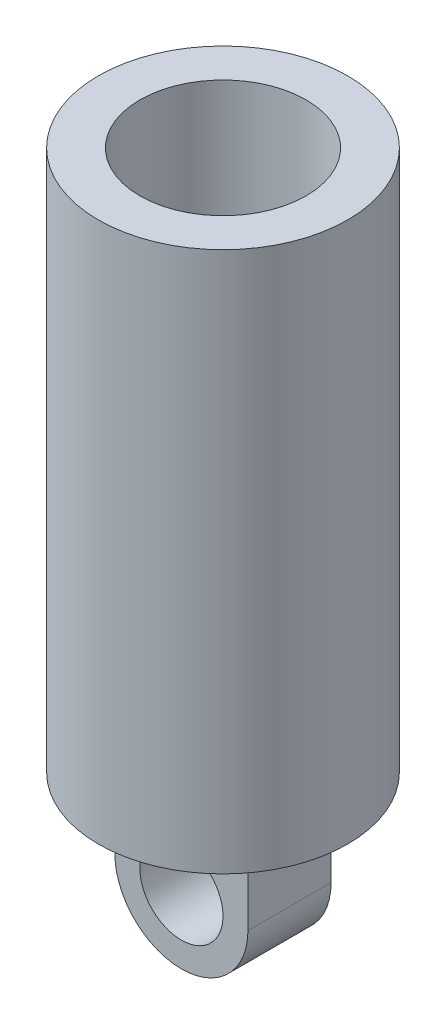
ISO-10303-21;
HEADER;
FILE_DESCRIPTION(('STEP AP214'),'2;1');
FILE_NAME('part.step','',(''),(''),'','','');
FILE_SCHEMA(('AUTOMOTIVE_DESIGN { 1 0 10303 214 1 1 1 1 }'));
ENDSEC;
DATA;
#1=APPLICATION_CONTEXT('core data for automotive mechanical design processes');
#2=APPLICATION_PROTOCOL_DEFINITION('international standard','automotive_design',2000,#1);
#3=PRODUCT_CONTEXT('',#1,'mechanical');
#4=PRODUCT('Part','Part','',(#3));
#5=PRODUCT_RELATED_PRODUCT_CATEGORY('part','',(#4));
#6=PRODUCT_DEFINITION_FORMATION('','',#4);
#7=PRODUCT_DEFINITION_CONTEXT('part definition',#1,'design');
#8=PRODUCT_DEFINITION('design','',#6,#7);
#9=PRODUCT_DEFINITION_SHAPE('','',#8);
#10=(LENGTH_UNIT() NAMED_UNIT(*) SI_UNIT(.MILLI.,.METRE.));
#11=(NAMED_UNIT(*) PLANE_ANGLE_UNIT() SI_UNIT($,.RADIAN.));
#12=(NAMED_UNIT(*) SI_UNIT($,.STERADIAN.) SOLID_ANGLE_UNIT());
#13=UNCERTAINTY_MEASURE_WITH_UNIT(LENGTH_MEASURE(1.E-05),#10,'distance_accuracy_value','');
#14=(GEOMETRIC_REPRESENTATION_CONTEXT(3) GLOBAL_UNCERTAINTY_ASSIGNED_CONTEXT((#13)) GLOBAL_UNIT_ASSIGNED_CONTEXT((#10,
#11,#12)) REPRESENTATION_CONTEXT('',''));
#15=CARTESIAN_POINT('',(0.,0.,0.));
#16=DIRECTION('',(0.,0.,1.));
#17=DIRECTION('',(1.,0.,0.));
#18=AXIS2_PLACEMENT_3D('',#15,#16,#17);
#19=CARTESIAN_POINT('',(-4.,0.,-2.5));
#20=DIRECTION('',(-1.,0.,0.));
#21=DIRECTION('',(0.,0.,-1.));
#22=AXIS2_PLACEMENT_3D('',#19,#20,#21);
#23=PLANE('',#22);
#24=DIRECTION('',(0.,1.,0.));
#25=VECTOR('',#24,1.);
#26=CARTESIAN_POINT('',(-4.,0.,2.5));
#27=LINE('',#26,#25);
#28=CARTESIAN_POINT('',(-4.,0.,2.5));
#29=VERTEX_POINT('',#28);
#30=CARTESIAN_POINT('',(-4.,5.,2.5));
#31=VERTEX_POINT('',#30);
#32=EDGE_CURVE('E104',#29,#31,#27,.T.);
#33=ORIENTED_EDGE('',*,*,#32,.T.);
#34=DIRECTION('',(0.,0.,1.));
#35=VECTOR('',#34,1.);
#36=CARTESIAN_POINT('',(-4.,5.,-2.5));
#37=LINE('',#36,#35);
#38=CARTESIAN_POINT('',(-4.,5.,-2.5));
#39=VERTEX_POINT('',#38);
#40=EDGE_CURVE('E92',#39,#31,#37,.T.);
#41=ORIENTED_EDGE('',*,*,#40,.F.);
#42=DIRECTION('',(0.,1.,0.));
#43=VECTOR('',#42,1.);
#44=CARTESIAN_POINT('',(-4.,0.,-2.5));
#45=LINE('',#44,#43);
#46=CARTESIAN_POINT('',(-4.,0.,-2.5));
#47=VERTEX_POINT('',#46);
#48=EDGE_CURVE('E112',#47,#39,#45,.T.);
#49=ORIENTED_EDGE('',*,*,#48,.F.);
#50=DIRECTION('',(0.,0.,1.));
#51=VECTOR('',#50,1.);
#52=CARTESIAN_POINT('',(-4.,0.,-2.5));
#53=LINE('',#52,#51);
#54=EDGE_CURVE('E48',#47,#29,#53,.T.);
#55=ORIENTED_EDGE('',*,*,#54,.T.);
#56=EDGE_LOOP('',(#33,#41,#49,#55));
#57=FACE_BOUND('',#56,.T.);
#58=ADVANCED_FACE('F39',(#57),#23,.T.);
#59=CARTESIAN_POINT('',(0.,0.,-2.5));
#60=DIRECTION('',(0.,0.,1.));
#61=DIRECTION('',(-1.,0.,0.));
#62=AXIS2_PLACEMENT_3D('',#59,#60,#61);
#63=CYLINDRICAL_SURFACE('',#62,4.);
#64=CARTESIAN_POINT('',(0.,0.,2.5));
#65=DIRECTION('',(0.,0.,1.));
#66=DIRECTION('',(1.,0.,0.));
#67=AXIS2_PLACEMENT_3D('',#64,#65,#66);
#68=CIRCLE('',#67,4.);
#69=CARTESIAN_POINT('',(4.,0.,2.5));
#70=VERTEX_POINT('',#69);
#71=EDGE_CURVE('E102',#29,#70,#68,.T.);
#72=ORIENTED_EDGE('',*,*,#71,.F.);
#73=ORIENTED_EDGE('',*,*,#54,.F.);
#74=CARTESIAN_POINT('',(0.,0.,-2.5));
#75=DIRECTION('',(0.,0.,1.));
#76=DIRECTION('',(1.,0.,0.));
#77=AXIS2_PLACEMENT_3D('',#74,#75,#76);
#78=CIRCLE('',#77,4.);
#79=CARTESIAN_POINT('',(4.,0.,-2.5));
#80=VERTEX_POINT('',#79);
#81=EDGE_CURVE('E84',#47,#80,#78,.T.);
#82=ORIENTED_EDGE('',*,*,#81,.T.);
#83=DIRECTION('',(0.,0.,1.));
#84=VECTOR('',#83,1.);
#85=CARTESIAN_POINT('',(4.,0.,-2.5));
#86=LINE('',#85,#84);
#87=EDGE_CURVE('E98',#80,#70,#86,.T.);
#88=ORIENTED_EDGE('',*,*,#87,.T.);
#89=EDGE_LOOP('',(#72,#73,#82,#88));
#90=FACE_BOUND('',#89,.T.);
#91=ADVANCED_FACE('F150',(#90),#63,.T.);
#92=CARTESIAN_POINT('',(4.,0.,-2.5));
#93=DIRECTION('',(-1.,0.,0.));
#94=DIRECTION('',(0.,0.,-1.));
#95=AXIS2_PLACEMENT_3D('',#92,#93,#94);
#96=PLANE('',#95);
#97=DIRECTION('',(0.,1.,0.));
#98=VECTOR('',#97,1.);
#99=CARTESIAN_POINT('',(4.,0.,2.5));
#100=LINE('',#99,#98);
#101=CARTESIAN_POINT('',(4.,5.,2.5));
#102=VERTEX_POINT('',#101);
#103=EDGE_CURVE('E71',#70,#102,#100,.T.);
#104=ORIENTED_EDGE('',*,*,#103,.F.);
#105=ORIENTED_EDGE('',*,*,#87,.F.);
#106=DIRECTION('',(0.,1.,0.));
#107=VECTOR('',#106,1.);
#108=CARTESIAN_POINT('',(4.,0.,-2.5));
#109=LINE('',#108,#107);
#110=CARTESIAN_POINT('',(4.,5.,-2.5));
#111=VERTEX_POINT('',#110);
#112=EDGE_CURVE('E97',#80,#111,#109,.T.);
#113=ORIENTED_EDGE('',*,*,#112,.T.);
#114=DIRECTION('',(0.,0.,1.));
#115=VECTOR('',#114,1.);
#116=CARTESIAN_POINT('',(4.,5.,-2.5));
#117=LINE('',#116,#115);
#118=EDGE_CURVE('E89',#111,#102,#117,.T.);
#119=ORIENTED_EDGE('',*,*,#118,.T.);
#120=EDGE_LOOP('',(#104,#105,#113,#119));
#121=FACE_BOUND('',#120,.T.);
#122=ADVANCED_FACE('F96',(#121),#96,.F.);
#123=CARTESIAN_POINT('',(0.,0.,-2.5));
#124=DIRECTION('',(0.,0.,1.));
#125=DIRECTION('',(-1.,0.,0.));
#126=AXIS2_PLACEMENT_3D('',#123,#124,#125);
#127=CYLINDRICAL_SURFACE('',#126,2.5);
#128=CARTESIAN_POINT('',(0.,0.,-2.5));
#129=DIRECTION('',(0.,0.,1.));
#130=DIRECTION('',(1.,0.,0.));
#131=AXIS2_PLACEMENT_3D('',#128,#129,#130);
#132=CIRCLE('',#131,2.5);
#133=CARTESIAN_POINT('',(2.5,0.,-2.5));
#134=VERTEX_POINT('',#133);
#135=EDGE_CURVE('E94',#134,#134,#132,.T.);
#136=ORIENTED_EDGE('',*,*,#135,.F.);
#137=EDGE_LOOP('',(#136));
#138=FACE_BOUND('',#137,.T.);
#139=CARTESIAN_POINT('',(0.,0.,2.5));
#140=DIRECTION('',(0.,0.,1.));
#141=DIRECTION('',(1.,0.,0.));
#142=AXIS2_PLACEMENT_3D('',#139,#140,#141);
#143=CIRCLE('',#142,2.5);
#144=CARTESIAN_POINT('',(2.5,0.,2.5));
#145=VERTEX_POINT('',#144);
#146=EDGE_CURVE('E114',#145,#145,#143,.T.);
#147=ORIENTED_EDGE('',*,*,#146,.T.);
#148=EDGE_LOOP('',(#147));
#149=FACE_BOUND('',#148,.T.);
#150=ADVANCED_FACE('F41',(#138,#149),#127,.F.);
#151=CARTESIAN_POINT('',(0.,0.,-2.5));
#152=DIRECTION('',(0.,0.,-1.));
#153=DIRECTION('',(1.,0.,0.));
#154=AXIS2_PLACEMENT_3D('',#151,#152,#153);
#155=PLANE('',#154);
#156=ORIENTED_EDGE('',*,*,#135,.T.);
#157=EDGE_LOOP('',(#156));
#158=FACE_BOUND('',#157,.T.);
#159=ORIENTED_EDGE('',*,*,#48,.T.);
#160=DIRECTION('',(1.,0.,0.));
#161=VECTOR('',#160,1.);
#162=CARTESIAN_POINT('',(0.,5.,-2.5));
#163=LINE('',#162,#161);
#164=EDGE_CURVE('E56',#39,#111,#163,.T.);
#165=ORIENTED_EDGE('',*,*,#164,.T.);
#166=ORIENTED_EDGE('',*,*,#112,.F.);
#167=ORIENTED_EDGE('',*,*,#81,.F.);
#168=EDGE_LOOP('',(#159,#165,#166,#167));
#169=FACE_BOUND('',#168,.T.);
#170=ADVANCED_FACE('F161',(#158,#169),#155,.T.);
#171=CARTESIAN_POINT('',(0.,0.,2.5));
#172=DIRECTION('',(0.,0.,-1.));
#173=DIRECTION('',(1.,0.,0.));
#174=AXIS2_PLACEMENT_3D('',#171,#172,#173);
#175=PLANE('',#174);
#176=ORIENTED_EDGE('',*,*,#146,.F.);
#177=EDGE_LOOP('',(#176));
#178=FACE_BOUND('',#177,.T.);
#179=ORIENTED_EDGE('',*,*,#32,.F.);
#180=ORIENTED_EDGE('',*,*,#71,.T.);
#181=ORIENTED_EDGE('',*,*,#103,.T.);
#182=DIRECTION('',(1.,0.,0.));
#183=VECTOR('',#182,1.);
#184=CARTESIAN_POINT('',(0.,5.,2.5));
#185=LINE('',#184,#183);
#186=EDGE_CURVE('E78',#31,#102,#185,.T.);
#187=ORIENTED_EDGE('',*,*,#186,.F.);
#188=EDGE_LOOP('',(#179,#180,#181,#187));
#189=FACE_BOUND('',#188,.T.);
#190=ADVANCED_FACE('F101',(#178,#189),#175,.F.);
#191=CARTESIAN_POINT('',(0.,7.5,0.));
#192=DIRECTION('',(0.,-1.,0.));
#193=DIRECTION('',(0.,0.,1.));
#194=AXIS2_PLACEMENT_3D('',#191,#192,#193);
#195=CYLINDRICAL_SURFACE('',#194,7.5);
#196=CARTESIAN_POINT('',(0.,5.,0.));
#197=DIRECTION('',(0.,-1.,0.));
#198=DIRECTION('',(0.,0.,-1.));
#199=AXIS2_PLACEMENT_3D('',#196,#197,#198);
#200=CIRCLE('',#199,7.5);
#201=CARTESIAN_POINT('',(0.,5.,-7.5));
#202=VERTEX_POINT('',#201);
#203=EDGE_CURVE('E116',#202,#202,#200,.T.);
#204=ORIENTED_EDGE('',*,*,#203,.F.);
#205=EDGE_LOOP('',(#204));
#206=FACE_BOUND('',#205,.T.);
#207=CARTESIAN_POINT('',(0.,37.5,0.));
#208=DIRECTION('',(0.,-1.,0.));
#209=DIRECTION('',(0.,0.,-1.));
#210=AXIS2_PLACEMENT_3D('',#207,#208,#209);
#211=CIRCLE('',#210,7.5);
#212=CARTESIAN_POINT('',(0.,37.5,-7.5));
#213=VERTEX_POINT('',#212);
#214=EDGE_CURVE('E127',#213,#213,#211,.T.);
#215=ORIENTED_EDGE('',*,*,#214,.T.);
#216=EDGE_LOOP('',(#215));
#217=FACE_BOUND('',#216,.T.);
#218=ADVANCED_FACE('F160',(#206,#217),#195,.T.);
#219=CARTESIAN_POINT('',(0.,5.,0.));
#220=DIRECTION('',(0.,1.,0.));
#221=DIRECTION('',(0.,0.,-1.));
#222=AXIS2_PLACEMENT_3D('',#219,#220,#221);
#223=PLANE('',#222);
#224=ORIENTED_EDGE('',*,*,#186,.T.);
#225=ORIENTED_EDGE('',*,*,#118,.F.);
#226=ORIENTED_EDGE('',*,*,#164,.F.);
#227=ORIENTED_EDGE('',*,*,#40,.T.);
#228=EDGE_LOOP('',(#224,#225,#226,#227));
#229=FACE_BOUND('',#228,.T.);
#230=ORIENTED_EDGE('',*,*,#203,.T.);
#231=EDGE_LOOP('',(#230));
#232=FACE_BOUND('',#231,.T.);
#233=ADVANCED_FACE('F87',(#229,#232),#223,.F.);
#234=CARTESIAN_POINT('',(0.,37.5,0.));
#235=DIRECTION('',(0.,1.,0.));
#236=DIRECTION('',(0.,0.,-1.));
#237=AXIS2_PLACEMENT_3D('',#234,#235,#236);
#238=PLANE('',#237);
#239=ORIENTED_EDGE('',*,*,#214,.F.);
#240=EDGE_LOOP('',(#239));
#241=FACE_BOUND('',#240,.T.);
#242=CARTESIAN_POINT('',(0.,37.5,0.));
#243=DIRECTION('',(0.,-1.,0.));
#244=DIRECTION('',(0.,0.,-1.));
#245=AXIS2_PLACEMENT_3D('',#242,#243,#244);
#246=CIRCLE('',#245,5.);
#247=CARTESIAN_POINT('',(0.,37.5,-5.));
#248=VERTEX_POINT('',#247);
#249=EDGE_CURVE('E130',#248,#248,#246,.T.);
#250=ORIENTED_EDGE('',*,*,#249,.T.);
#251=EDGE_LOOP('',(#250));
#252=FACE_BOUND('',#251,.T.);
#253=ADVANCED_FACE('F134',(#241,#252),#238,.T.);
#254=CARTESIAN_POINT('',(0.,37.5,0.));
#255=DIRECTION('',(0.,-1.,0.));
#256=DIRECTION('',(0.,0.,1.));
#257=AXIS2_PLACEMENT_3D('',#254,#255,#256);
#258=CYLINDRICAL_SURFACE('',#257,5.);
#259=ORIENTED_EDGE('',*,*,#249,.F.);
#260=EDGE_LOOP('',(#259));
#261=FACE_BOUND('',#260,.T.);
#262=CARTESIAN_POINT('',(0.,7.5,0.));
#263=DIRECTION('',(0.,-1.,0.));
#264=DIRECTION('',(0.,0.,-1.));
#265=AXIS2_PLACEMENT_3D('',#262,#263,#264);
#266=CIRCLE('',#265,5.);
#267=CARTESIAN_POINT('',(0.,7.5,-5.));
#268=VERTEX_POINT('',#267);
#269=EDGE_CURVE('E11',#268,#268,#266,.F.);
#270=ORIENTED_EDGE('',*,*,#269,.F.);
#271=EDGE_LOOP('',(#270));
#272=FACE_BOUND('',#271,.T.);
#273=ADVANCED_FACE('F136',(#261,#272),#258,.F.);
#274=CARTESIAN_POINT('',(0.,7.5,0.));
#275=DIRECTION('',(0.,1.,0.));
#276=DIRECTION('',(0.,0.,-1.));
#277=AXIS2_PLACEMENT_3D('',#274,#275,#276);
#278=PLANE('',#277);
#279=ORIENTED_EDGE('',*,*,#269,.T.);
#280=EDGE_LOOP('',(#279));
#281=FACE_BOUND('',#280,.T.);
#282=ADVANCED_FACE('F139',(#281),#278,.T.);
#283=CLOSED_SHELL('',(#58,#91,#122,#150,#170,#190,#218,#233,#253,#273,#282));
#284=MANIFOLD_SOLID_BREP('B2',#283);
#285=ADVANCED_BREP_SHAPE_REPRESENTATION('',(#18,#284),#14);
#286=SHAPE_DEFINITION_REPRESENTATION(#9,#285);
ENDSEC;
END-ISO-10303-21;
